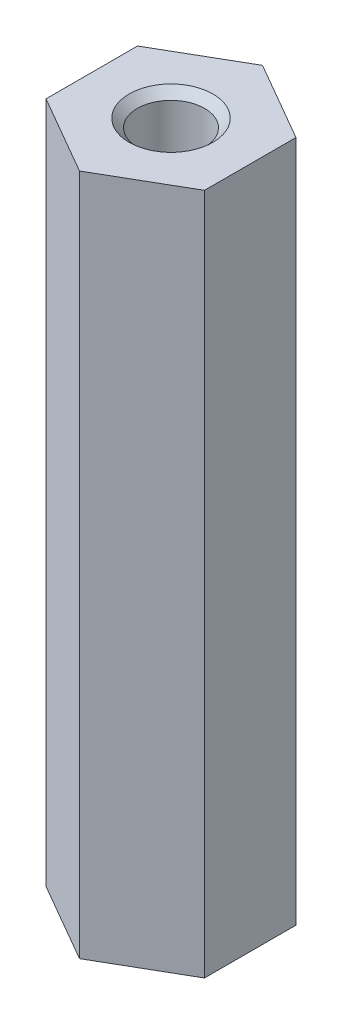
ISO-10303-21;
HEADER;
FILE_DESCRIPTION(('STEP AP214'),'2;1');
FILE_NAME('part.step','',(''),(''),'','','');
FILE_SCHEMA(('AUTOMOTIVE_DESIGN { 1 0 10303 214 1 1 1 1 }'));
ENDSEC;
DATA;
#1=APPLICATION_CONTEXT('core data for automotive mechanical design processes');
#2=APPLICATION_PROTOCOL_DEFINITION('international standard','automotive_design',2000,#1);
#3=PRODUCT_CONTEXT('',#1,'mechanical');
#4=PRODUCT('Part','Part','',(#3));
#5=PRODUCT_RELATED_PRODUCT_CATEGORY('part','',(#4));
#6=PRODUCT_DEFINITION_FORMATION('','',#4);
#7=PRODUCT_DEFINITION_CONTEXT('part definition',#1,'design');
#8=PRODUCT_DEFINITION('design','',#6,#7);
#9=PRODUCT_DEFINITION_SHAPE('','',#8);
#10=(LENGTH_UNIT() NAMED_UNIT(*) SI_UNIT(.MILLI.,.METRE.));
#11=(NAMED_UNIT(*) PLANE_ANGLE_UNIT() SI_UNIT($,.RADIAN.));
#12=(NAMED_UNIT(*) SI_UNIT($,.STERADIAN.) SOLID_ANGLE_UNIT());
#13=UNCERTAINTY_MEASURE_WITH_UNIT(LENGTH_MEASURE(1.E-05),#10,'distance_accuracy_value','');
#14=(GEOMETRIC_REPRESENTATION_CONTEXT(3) GLOBAL_UNCERTAINTY_ASSIGNED_CONTEXT((#13)) GLOBAL_UNIT_ASSIGNED_CONTEXT((#10,
#11,#12)) REPRESENTATION_CONTEXT('',''));
#15=CARTESIAN_POINT('',(0.,0.,0.));
#16=DIRECTION('',(0.,0.,1.));
#17=DIRECTION('',(1.,0.,0.));
#18=AXIS2_PLACEMENT_3D('',#15,#16,#17);
#19=CARTESIAN_POINT('',(-4.7625,41.,2.74963065701559));
#20=DIRECTION('',(0.5,0.,-0.866025403784439));
#21=DIRECTION('',(-0.866025403784438,0.,-0.5));
#22=AXIS2_PLACEMENT_3D('',#19,#20,#21);
#23=PLANE('',#22);
#24=DIRECTION('',(0.866025403784439,0.,0.5));
#25=VECTOR('',#24,1.);
#26=CARTESIAN_POINT('',(-4.7625,0.,2.74963065701559));
#27=LINE('',#26,#25);
#28=CARTESIAN_POINT('',(-4.7625,0.,2.74963065701559));
#29=VERTEX_POINT('',#28);
#30=CARTESIAN_POINT('',(0.,0.,5.49926131403119));
#31=VERTEX_POINT('',#30);
#32=EDGE_CURVE('E131',#29,#31,#27,.T.);
#33=ORIENTED_EDGE('',*,*,#32,.T.);
#34=DIRECTION('',(0.,-1.,0.));
#35=VECTOR('',#34,1.);
#36=CARTESIAN_POINT('',(0.,41.,5.49926131403119));
#37=LINE('',#36,#35);
#38=CARTESIAN_POINT('',(0.,41.,5.49926131403119));
#39=VERTEX_POINT('',#38);
#40=EDGE_CURVE('E149',#39,#31,#37,.T.);
#41=ORIENTED_EDGE('',*,*,#40,.F.);
#42=DIRECTION('',(0.866025403784439,0.,0.5));
#43=VECTOR('',#42,1.);
#44=CARTESIAN_POINT('',(-4.7625,41.,2.74963065701559));
#45=LINE('',#44,#43);
#46=CARTESIAN_POINT('',(-4.7625,41.,2.74963065701559));
#47=VERTEX_POINT('',#46);
#48=EDGE_CURVE('E142',#47,#39,#45,.T.);
#49=ORIENTED_EDGE('',*,*,#48,.F.);
#50=DIRECTION('',(0.,-1.,0.));
#51=VECTOR('',#50,1.);
#52=CARTESIAN_POINT('',(-4.7625,41.,2.74963065701559));
#53=LINE('',#52,#51);
#54=EDGE_CURVE('E127',#47,#29,#53,.T.);
#55=ORIENTED_EDGE('',*,*,#54,.T.);
#56=EDGE_LOOP('',(#33,#41,#49,#55));
#57=FACE_BOUND('',#56,.T.);
#58=ADVANCED_FACE('F41',(#57),#23,.F.);
#59=CARTESIAN_POINT('',(0.,41.,5.49926131403119));
#60=DIRECTION('',(-0.5,0.,-0.866025403784438));
#61=DIRECTION('',(-0.866025403784439,0.,0.5));
#62=AXIS2_PLACEMENT_3D('',#59,#60,#61);
#63=PLANE('',#62);
#64=DIRECTION('',(0.866025403784439,0.,-0.5));
#65=VECTOR('',#64,1.);
#66=CARTESIAN_POINT('',(0.,0.,5.49926131403119));
#67=LINE('',#66,#65);
#68=CARTESIAN_POINT('',(4.7625,0.,2.74963065701559));
#69=VERTEX_POINT('',#68);
#70=EDGE_CURVE('E134',#31,#69,#67,.T.);
#71=ORIENTED_EDGE('',*,*,#70,.T.);
#72=DIRECTION('',(0.,-1.,0.));
#73=VECTOR('',#72,1.);
#74=CARTESIAN_POINT('',(4.7625,41.,2.74963065701559));
#75=LINE('',#74,#73);
#76=CARTESIAN_POINT('',(4.7625,41.,2.74963065701559));
#77=VERTEX_POINT('',#76);
#78=EDGE_CURVE('E146',#77,#69,#75,.T.);
#79=ORIENTED_EDGE('',*,*,#78,.F.);
#80=DIRECTION('',(0.866025403784439,0.,-0.5));
#81=VECTOR('',#80,1.);
#82=CARTESIAN_POINT('',(0.,41.,5.49926131403119));
#83=LINE('',#82,#81);
#84=EDGE_CURVE('E98',#39,#77,#83,.T.);
#85=ORIENTED_EDGE('',*,*,#84,.F.);
#86=ORIENTED_EDGE('',*,*,#40,.T.);
#87=EDGE_LOOP('',(#71,#79,#85,#86));
#88=FACE_BOUND('',#87,.T.);
#89=ADVANCED_FACE('F172',(#88),#63,.F.);
#90=CARTESIAN_POINT('',(4.7625,41.,2.74963065701559));
#91=DIRECTION('',(-1.,0.,0.));
#92=DIRECTION('',(0.,0.,1.));
#93=AXIS2_PLACEMENT_3D('',#90,#91,#92);
#94=PLANE('',#93);
#95=DIRECTION('',(0.,0.,-1.));
#96=VECTOR('',#95,1.);
#97=CARTESIAN_POINT('',(4.7625,0.,2.74963065701559));
#98=LINE('',#97,#96);
#99=CARTESIAN_POINT('',(4.7625,0.,-2.74963065701559));
#100=VERTEX_POINT('',#99);
#101=EDGE_CURVE('E137',#69,#100,#98,.T.);
#102=ORIENTED_EDGE('',*,*,#101,.T.);
#103=DIRECTION('',(0.,-1.,0.));
#104=VECTOR('',#103,1.);
#105=CARTESIAN_POINT('',(4.7625,41.,-2.74963065701559));
#106=LINE('',#105,#104);
#107=CARTESIAN_POINT('',(4.7625,41.,-2.74963065701559));
#108=VERTEX_POINT('',#107);
#109=EDGE_CURVE('E122',#108,#100,#106,.T.);
#110=ORIENTED_EDGE('',*,*,#109,.F.);
#111=DIRECTION('',(0.,0.,-1.));
#112=VECTOR('',#111,1.);
#113=CARTESIAN_POINT('',(4.7625,41.,2.74963065701559));
#114=LINE('',#113,#112);
#115=EDGE_CURVE('E113',#77,#108,#114,.T.);
#116=ORIENTED_EDGE('',*,*,#115,.F.);
#117=ORIENTED_EDGE('',*,*,#78,.T.);
#118=EDGE_LOOP('',(#102,#110,#116,#117));
#119=FACE_BOUND('',#118,.T.);
#120=ADVANCED_FACE('F178',(#119),#94,.F.);
#121=CARTESIAN_POINT('',(4.7625,41.,-2.74963065701559));
#122=DIRECTION('',(-0.5,0.,0.866025403784438));
#123=DIRECTION('',(0.866025403784439,0.,0.5));
#124=AXIS2_PLACEMENT_3D('',#121,#122,#123);
#125=PLANE('',#124);
#126=DIRECTION('',(-0.866025403784439,0.,-0.5));
#127=VECTOR('',#126,1.);
#128=CARTESIAN_POINT('',(4.7625,0.,-2.74963065701559));
#129=LINE('',#128,#127);
#130=CARTESIAN_POINT('',(0.,0.,-5.49926131403119));
#131=VERTEX_POINT('',#130);
#132=EDGE_CURVE('E121',#100,#131,#129,.T.);
#133=ORIENTED_EDGE('',*,*,#132,.T.);
#134=DIRECTION('',(0.,-1.,0.));
#135=VECTOR('',#134,1.);
#136=CARTESIAN_POINT('',(0.,41.,-5.49926131403119));
#137=LINE('',#136,#135);
#138=CARTESIAN_POINT('',(0.,41.,-5.49926131403119));
#139=VERTEX_POINT('',#138);
#140=EDGE_CURVE('E118',#139,#131,#137,.T.);
#141=ORIENTED_EDGE('',*,*,#140,.F.);
#142=DIRECTION('',(-0.866025403784439,0.,-0.5));
#143=VECTOR('',#142,1.);
#144=CARTESIAN_POINT('',(4.7625,41.,-2.74963065701559));
#145=LINE('',#144,#143);
#146=EDGE_CURVE('E107',#108,#139,#145,.T.);
#147=ORIENTED_EDGE('',*,*,#146,.F.);
#148=ORIENTED_EDGE('',*,*,#109,.T.);
#149=EDGE_LOOP('',(#133,#141,#147,#148));
#150=FACE_BOUND('',#149,.T.);
#151=ADVANCED_FACE('F119',(#150),#125,.F.);
#152=CARTESIAN_POINT('',(0.,41.,-5.49926131403119));
#153=DIRECTION('',(0.5,0.,0.866025403784439));
#154=DIRECTION('',(0.866025403784439,0.,-0.5));
#155=AXIS2_PLACEMENT_3D('',#152,#153,#154);
#156=PLANE('',#155);
#157=DIRECTION('',(-0.866025403784439,0.,0.5));
#158=VECTOR('',#157,1.);
#159=CARTESIAN_POINT('',(0.,0.,-5.49926131403119));
#160=LINE('',#159,#158);
#161=CARTESIAN_POINT('',(-4.7625,0.,-2.74963065701559));
#162=VERTEX_POINT('',#161);
#163=EDGE_CURVE('E83',#131,#162,#160,.T.);
#164=ORIENTED_EDGE('',*,*,#163,.T.);
#165=DIRECTION('',(0.,-1.,0.));
#166=VECTOR('',#165,1.);
#167=CARTESIAN_POINT('',(-4.7625,41.,-2.74963065701559));
#168=LINE('',#167,#166);
#169=CARTESIAN_POINT('',(-4.7625,41.,-2.74963065701559));
#170=VERTEX_POINT('',#169);
#171=EDGE_CURVE('E123',#170,#162,#168,.T.);
#172=ORIENTED_EDGE('',*,*,#171,.F.);
#173=DIRECTION('',(-0.866025403784439,0.,0.5));
#174=VECTOR('',#173,1.);
#175=CARTESIAN_POINT('',(0.,41.,-5.49926131403119));
#176=LINE('',#175,#174);
#177=EDGE_CURVE('E111',#139,#170,#176,.T.);
#178=ORIENTED_EDGE('',*,*,#177,.F.);
#179=ORIENTED_EDGE('',*,*,#140,.T.);
#180=EDGE_LOOP('',(#164,#172,#178,#179));
#181=FACE_BOUND('',#180,.T.);
#182=ADVANCED_FACE('F125',(#181),#156,.F.);
#183=CARTESIAN_POINT('',(-4.7625,41.,-2.74963065701559));
#184=DIRECTION('',(1.,0.,0.));
#185=DIRECTION('',(0.,0.,-1.));
#186=AXIS2_PLACEMENT_3D('',#183,#184,#185);
#187=PLANE('',#186);
#188=DIRECTION('',(0.,0.,1.));
#189=VECTOR('',#188,1.);
#190=CARTESIAN_POINT('',(-4.7625,0.,-2.74963065701559));
#191=LINE('',#190,#189);
#192=EDGE_CURVE('E89',#162,#29,#191,.T.);
#193=ORIENTED_EDGE('',*,*,#192,.T.);
#194=ORIENTED_EDGE('',*,*,#54,.F.);
#195=DIRECTION('',(0.,0.,1.));
#196=VECTOR('',#195,1.);
#197=CARTESIAN_POINT('',(-4.7625,41.,-2.74963065701559));
#198=LINE('',#197,#196);
#199=EDGE_CURVE('E59',#170,#47,#198,.T.);
#200=ORIENTED_EDGE('',*,*,#199,.F.);
#201=ORIENTED_EDGE('',*,*,#171,.T.);
#202=EDGE_LOOP('',(#193,#194,#200,#201));
#203=FACE_BOUND('',#202,.T.);
#204=ADVANCED_FACE('F193',(#203),#187,.F.);
#205=CARTESIAN_POINT('',(0.,41.,0.));
#206=DIRECTION('',(0.,1.,0.));
#207=DIRECTION('',(0.,0.,1.));
#208=AXIS2_PLACEMENT_3D('',#205,#206,#207);
#209=PLANE('',#208);
#210=CARTESIAN_POINT('',(0.,41.,0.));
#211=DIRECTION('',(0.,1.,0.));
#212=DIRECTION('',(0.,0.,1.));
#213=AXIS2_PLACEMENT_3D('',#210,#211,#212);
#214=CIRCLE('',#213,2.51929999999999);
#215=CARTESIAN_POINT('',(0.,41.,2.51929999999999));
#216=VERTEX_POINT('',#215);
#217=EDGE_CURVE('E11',#216,#216,#214,.F.);
#218=ORIENTED_EDGE('',*,*,#217,.T.);
#219=EDGE_LOOP('',(#218));
#220=FACE_BOUND('',#219,.T.);
#221=ORIENTED_EDGE('',*,*,#48,.T.);
#222=ORIENTED_EDGE('',*,*,#84,.T.);
#223=ORIENTED_EDGE('',*,*,#115,.T.);
#224=ORIENTED_EDGE('',*,*,#146,.T.);
#225=ORIENTED_EDGE('',*,*,#177,.T.);
#226=ORIENTED_EDGE('',*,*,#199,.T.);
#227=EDGE_LOOP('',(#221,#222,#223,#224,#225,#226));
#228=FACE_BOUND('',#227,.T.);
#229=ADVANCED_FACE('F109',(#220,#228),#209,.T.);
#230=CARTESIAN_POINT('',(0.,0.,0.));
#231=DIRECTION('',(0.,1.,0.));
#232=DIRECTION('',(0.,0.,1.));
#233=AXIS2_PLACEMENT_3D('',#230,#231,#232);
#234=PLANE('',#233);
#235=CARTESIAN_POINT('',(0.,0.,0.));
#236=DIRECTION('',(0.,1.,0.));
#237=DIRECTION('',(0.,0.,1.));
#238=AXIS2_PLACEMENT_3D('',#235,#236,#237);
#239=CIRCLE('',#238,2.5193);
#240=CARTESIAN_POINT('',(0.,0.,2.5193));
#241=VERTEX_POINT('',#240);
#242=EDGE_CURVE('E154',#241,#241,#239,.T.);
#243=ORIENTED_EDGE('',*,*,#242,.T.);
#244=EDGE_LOOP('',(#243));
#245=FACE_BOUND('',#244,.T.);
#246=ORIENTED_EDGE('',*,*,#32,.F.);
#247=ORIENTED_EDGE('',*,*,#192,.F.);
#248=ORIENTED_EDGE('',*,*,#163,.F.);
#249=ORIENTED_EDGE('',*,*,#132,.F.);
#250=ORIENTED_EDGE('',*,*,#101,.F.);
#251=ORIENTED_EDGE('',*,*,#70,.F.);
#252=EDGE_LOOP('',(#246,#247,#248,#249,#250,#251));
#253=FACE_BOUND('',#252,.T.);
#254=ADVANCED_FACE('F196',(#245,#253),#234,.F.);
#255=CARTESIAN_POINT('',(0.,33.,0.));
#256=DIRECTION('',(0.,1.,0.));
#257=DIRECTION('',(0.,0.,1.));
#258=AXIS2_PLACEMENT_3D('',#255,#256,#257);
#259=CONICAL_SURFACE('',#258,2.0193,1.02974425867665);
#260=CARTESIAN_POINT('',(0.,31.7866821519976,0.));
#261=VERTEX_POINT('',#260);
#262=VERTEX_LOOP('',#261);
#263=FACE_BOUND('',#262,.T.);
#264=CARTESIAN_POINT('',(0.,33.,0.));
#265=DIRECTION('',(0.,1.,0.));
#266=DIRECTION('',(0.,0.,1.));
#267=AXIS2_PLACEMENT_3D('',#264,#265,#266);
#268=CIRCLE('',#267,2.0193);
#269=CARTESIAN_POINT('',(0.,33.,2.0193));
#270=VERTEX_POINT('',#269);
#271=EDGE_CURVE('E135',#270,#270,#268,.T.);
#272=ORIENTED_EDGE('',*,*,#271,.T.);
#273=EDGE_LOOP('',(#272));
#274=FACE_BOUND('',#273,.T.);
#275=ADVANCED_FACE('F199',(#263,#274),#259,.F.);
#276=CARTESIAN_POINT('',(0.,41.,0.));
#277=DIRECTION('',(0.,1.,0.));
#278=DIRECTION('',(0.,0.,1.));
#279=AXIS2_PLACEMENT_3D('',#276,#277,#278);
#280=CYLINDRICAL_SURFACE('',#279,2.01929999999999);
#281=CARTESIAN_POINT('',(0.,40.5,0.));
#282=DIRECTION('',(0.,1.,0.));
#283=DIRECTION('',(0.,0.,1.));
#284=AXIS2_PLACEMENT_3D('',#281,#282,#283);
#285=CIRCLE('',#284,2.01929999999999);
#286=CARTESIAN_POINT('',(0.,40.5,2.01929999999999));
#287=VERTEX_POINT('',#286);
#288=EDGE_CURVE('E51',#287,#287,#285,.T.);
#289=ORIENTED_EDGE('',*,*,#288,.T.);
#290=EDGE_LOOP('',(#289));
#291=FACE_BOUND('',#290,.T.);
#292=ORIENTED_EDGE('',*,*,#271,.F.);
#293=EDGE_LOOP('',(#292));
#294=FACE_BOUND('',#293,.T.);
#295=ADVANCED_FACE('F159',(#291,#294),#280,.F.);
#296=CARTESIAN_POINT('',(0.,8.,0.));
#297=DIRECTION('',(0.,-1.,0.));
#298=DIRECTION('',(0.,0.,-1.));
#299=AXIS2_PLACEMENT_3D('',#296,#297,#298);
#300=CONICAL_SURFACE('',#299,2.0193,1.02974425867665);
#301=CARTESIAN_POINT('',(0.,9.21331784800235,0.));
#302=VERTEX_POINT('',#301);
#303=VERTEX_LOOP('',#302);
#304=FACE_BOUND('',#303,.T.);
#305=CARTESIAN_POINT('',(0.,8.,0.));
#306=DIRECTION('',(0.,-1.,0.));
#307=DIRECTION('',(0.,0.,-1.));
#308=AXIS2_PLACEMENT_3D('',#305,#306,#307);
#309=CIRCLE('',#308,2.0193);
#310=CARTESIAN_POINT('',(0.,8.,-2.0193));
#311=VERTEX_POINT('',#310);
#312=EDGE_CURVE('E221',#311,#311,#309,.T.);
#313=ORIENTED_EDGE('',*,*,#312,.T.);
#314=EDGE_LOOP('',(#313));
#315=FACE_BOUND('',#314,.T.);
#316=ADVANCED_FACE('F209',(#304,#315),#300,.F.);
#317=CARTESIAN_POINT('',(0.,0.,0.));
#318=DIRECTION('',(0.,-1.,0.));
#319=DIRECTION('',(0.,0.,-1.));
#320=AXIS2_PLACEMENT_3D('',#317,#318,#319);
#321=CYLINDRICAL_SURFACE('',#320,2.01929999999999);
#322=CARTESIAN_POINT('',(0.,0.500000000000005,0.));
#323=DIRECTION('',(0.,1.,0.));
#324=DIRECTION('',(0.,0.,1.));
#325=AXIS2_PLACEMENT_3D('',#322,#323,#324);
#326=CIRCLE('',#325,2.01929999999999);
#327=CARTESIAN_POINT('',(0.,0.500000000000005,2.01929999999999));
#328=VERTEX_POINT('',#327);
#329=EDGE_CURVE('E151',#328,#328,#326,.F.);
#330=ORIENTED_EDGE('',*,*,#329,.T.);
#331=EDGE_LOOP('',(#330));
#332=FACE_BOUND('',#331,.T.);
#333=ORIENTED_EDGE('',*,*,#312,.F.);
#334=EDGE_LOOP('',(#333));
#335=FACE_BOUND('',#334,.T.);
#336=ADVANCED_FACE('F168',(#332,#335),#321,.F.);
#337=CARTESIAN_POINT('',(0.,0.500000000000005,0.));
#338=DIRECTION('',(0.,-1.,0.));
#339=DIRECTION('',(0.,0.,-1.));
#340=AXIS2_PLACEMENT_3D('',#337,#338,#339);
#341=CONICAL_SURFACE('',#340,2.01929999999999,0.785398163397448);
#342=ORIENTED_EDGE('',*,*,#242,.F.);
#343=EDGE_LOOP('',(#342));
#344=FACE_BOUND('',#343,.T.);
#345=ORIENTED_EDGE('',*,*,#329,.F.);
#346=EDGE_LOOP('',(#345));
#347=FACE_BOUND('',#346,.T.);
#348=ADVANCED_FACE('F163',(#344,#347),#341,.F.);
#349=CARTESIAN_POINT('',(0.,40.5,0.));
#350=DIRECTION('',(0.,1.,0.));
#351=DIRECTION('',(0.,0.,1.));
#352=AXIS2_PLACEMENT_3D('',#349,#350,#351);
#353=CONICAL_SURFACE('',#352,2.01929999999999,0.785398163397446);
#354=ORIENTED_EDGE('',*,*,#217,.F.);
#355=EDGE_LOOP('',(#354));
#356=FACE_BOUND('',#355,.T.);
#357=ORIENTED_EDGE('',*,*,#288,.F.);
#358=EDGE_LOOP('',(#357));
#359=FACE_BOUND('',#358,.T.);
#360=ADVANCED_FACE('F44',(#356,#359),#353,.F.);
#361=CLOSED_SHELL('',(#58,#89,#120,#151,#182,#204,#229,#254,#275,#295,#316,#336,#348,#360));
#362=MANIFOLD_SOLID_BREP('B2',#361);
#363=ADVANCED_BREP_SHAPE_REPRESENTATION('',(#18,#362),#14);
#364=SHAPE_DEFINITION_REPRESENTATION(#9,#363);
ENDSEC;
END-ISO-10303-21;
